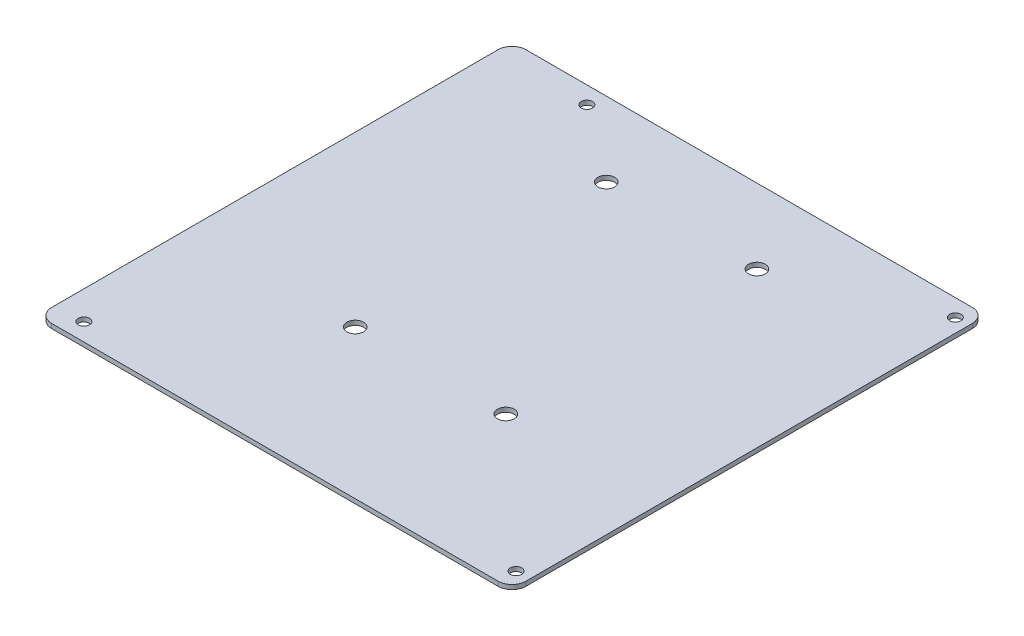
ISO-10303-21;
HEADER;
FILE_DESCRIPTION(('STEP AP214'),'2;1');
FILE_NAME('part.step','',(''),(''),'','','');
FILE_SCHEMA(('AUTOMOTIVE_DESIGN { 1 0 10303 214 1 1 1 1 }'));
ENDSEC;
DATA;
#1=APPLICATION_CONTEXT('core data for automotive mechanical design processes');
#2=APPLICATION_PROTOCOL_DEFINITION('international standard','automotive_design',2000,#1);
#3=PRODUCT_CONTEXT('',#1,'mechanical');
#4=PRODUCT('Part','Part','',(#3));
#5=PRODUCT_RELATED_PRODUCT_CATEGORY('part','',(#4));
#6=PRODUCT_DEFINITION_FORMATION('','',#4);
#7=PRODUCT_DEFINITION_CONTEXT('part definition',#1,'design');
#8=PRODUCT_DEFINITION('design','',#6,#7);
#9=PRODUCT_DEFINITION_SHAPE('','',#8);
#10=(LENGTH_UNIT() NAMED_UNIT(*) SI_UNIT(.MILLI.,.METRE.));
#11=(NAMED_UNIT(*) PLANE_ANGLE_UNIT() SI_UNIT($,.RADIAN.));
#12=(NAMED_UNIT(*) SI_UNIT($,.STERADIAN.) SOLID_ANGLE_UNIT());
#13=UNCERTAINTY_MEASURE_WITH_UNIT(LENGTH_MEASURE(1.E-05),#10,'distance_accuracy_value','');
#14=(GEOMETRIC_REPRESENTATION_CONTEXT(3) GLOBAL_UNCERTAINTY_ASSIGNED_CONTEXT((#13)) GLOBAL_UNIT_ASSIGNED_CONTEXT((#10,
#11,#12)) REPRESENTATION_CONTEXT('',''));
#15=CARTESIAN_POINT('',(0.,0.,0.));
#16=DIRECTION('',(0.,0.,1.));
#17=DIRECTION('',(1.,0.,0.));
#18=AXIS2_PLACEMENT_3D('',#15,#16,#17);
#19=CARTESIAN_POINT('',(85.,1.6,85.));
#20=DIRECTION('',(-1.,0.,0.));
#21=DIRECTION('',(0.,0.,1.));
#22=AXIS2_PLACEMENT_3D('',#19,#20,#21);
#23=PLANE('',#22);
#24=DIRECTION('',(0.,0.,-1.));
#25=VECTOR('',#24,1.);
#26=CARTESIAN_POINT('',(85.,0.,85.));
#27=LINE('',#26,#25);
#28=CARTESIAN_POINT('',(85.,0.,80.));
#29=VERTEX_POINT('',#28);
#30=CARTESIAN_POINT('',(85.,0.,-80.));
#31=VERTEX_POINT('',#30);
#32=EDGE_CURVE('E142',#29,#31,#27,.T.);
#33=ORIENTED_EDGE('',*,*,#32,.T.);
#34=DIRECTION('',(0.,-1.,0.));
#35=VECTOR('',#34,1.);
#36=CARTESIAN_POINT('',(85.,1.6,-80.));
#37=LINE('',#36,#35);
#38=CARTESIAN_POINT('',(85.,1.6,-80.));
#39=VERTEX_POINT('',#38);
#40=EDGE_CURVE('E117',#31,#39,#37,.F.);
#41=ORIENTED_EDGE('',*,*,#40,.T.);
#42=DIRECTION('',(0.,0.,-1.));
#43=VECTOR('',#42,1.);
#44=CARTESIAN_POINT('',(85.,1.6,85.));
#45=LINE('',#44,#43);
#46=CARTESIAN_POINT('',(85.,1.6,80.));
#47=VERTEX_POINT('',#46);
#48=EDGE_CURVE('E156',#47,#39,#45,.T.);
#49=ORIENTED_EDGE('',*,*,#48,.F.);
#50=DIRECTION('',(0.,-1.,0.));
#51=VECTOR('',#50,1.);
#52=CARTESIAN_POINT('',(85.,1.6,80.));
#53=LINE('',#52,#51);
#54=EDGE_CURVE('E123',#47,#29,#53,.T.);
#55=ORIENTED_EDGE('',*,*,#54,.T.);
#56=EDGE_LOOP('',(#33,#41,#49,#55));
#57=FACE_BOUND('',#56,.T.);
#58=ADVANCED_FACE('F43',(#57),#23,.F.);
#59=CARTESIAN_POINT('',(-85.,1.6,-85.));
#60=DIRECTION('',(0.,0.,1.));
#61=DIRECTION('',(1.,0.,0.));
#62=AXIS2_PLACEMENT_3D('',#59,#60,#61);
#63=PLANE('',#62);
#64=DIRECTION('',(-1.,0.,0.));
#65=VECTOR('',#64,1.);
#66=CARTESIAN_POINT('',(-85.,1.6,-85.));
#67=LINE('',#66,#65);
#68=CARTESIAN_POINT('',(80.,1.6,-85.));
#69=VERTEX_POINT('',#68);
#70=CARTESIAN_POINT('',(-80.,1.6,-85.));
#71=VERTEX_POINT('',#70);
#72=EDGE_CURVE('E133',#69,#71,#67,.T.);
#73=ORIENTED_EDGE('',*,*,#72,.F.);
#74=DIRECTION('',(0.,-1.,0.));
#75=VECTOR('',#74,1.);
#76=CARTESIAN_POINT('',(80.,1.6,-85.));
#77=LINE('',#76,#75);
#78=CARTESIAN_POINT('',(80.,0.,-85.));
#79=VERTEX_POINT('',#78);
#80=EDGE_CURVE('E116',#69,#79,#77,.T.);
#81=ORIENTED_EDGE('',*,*,#80,.T.);
#82=DIRECTION('',(-1.,0.,0.));
#83=VECTOR('',#82,1.);
#84=CARTESIAN_POINT('',(-85.,0.,-85.));
#85=LINE('',#84,#83);
#86=CARTESIAN_POINT('',(-80.,0.,-85.));
#87=VERTEX_POINT('',#86);
#88=EDGE_CURVE('E130',#79,#87,#85,.T.);
#89=ORIENTED_EDGE('',*,*,#88,.T.);
#90=DIRECTION('',(0.,-1.,0.));
#91=VECTOR('',#90,1.);
#92=CARTESIAN_POINT('',(-80.,1.6,-85.));
#93=LINE('',#92,#91);
#94=EDGE_CURVE('E136',#87,#71,#93,.F.);
#95=ORIENTED_EDGE('',*,*,#94,.T.);
#96=EDGE_LOOP('',(#73,#81,#89,#95));
#97=FACE_BOUND('',#96,.T.);
#98=ADVANCED_FACE('F129',(#97),#63,.F.);
#99=CARTESIAN_POINT('',(-85.,1.6,85.));
#100=DIRECTION('',(1.,0.,0.));
#101=DIRECTION('',(0.,0.,-1.));
#102=AXIS2_PLACEMENT_3D('',#99,#100,#101);
#103=PLANE('',#102);
#104=DIRECTION('',(0.,0.,1.));
#105=VECTOR('',#104,1.);
#106=CARTESIAN_POINT('',(-85.,1.6,85.));
#107=LINE('',#106,#105);
#108=CARTESIAN_POINT('',(-85.,1.6,-80.));
#109=VERTEX_POINT('',#108);
#110=CARTESIAN_POINT('',(-85.,1.6,80.));
#111=VERTEX_POINT('',#110);
#112=EDGE_CURVE('E229',#109,#111,#107,.T.);
#113=ORIENTED_EDGE('',*,*,#112,.F.);
#114=DIRECTION('',(0.,-1.,0.));
#115=VECTOR('',#114,1.);
#116=CARTESIAN_POINT('',(-85.,1.6,-80.));
#117=LINE('',#116,#115);
#118=CARTESIAN_POINT('',(-85.,0.,-80.));
#119=VERTEX_POINT('',#118);
#120=EDGE_CURVE('E186',#109,#119,#117,.T.);
#121=ORIENTED_EDGE('',*,*,#120,.T.);
#122=DIRECTION('',(0.,0.,1.));
#123=VECTOR('',#122,1.);
#124=CARTESIAN_POINT('',(-85.,0.,85.));
#125=LINE('',#124,#123);
#126=CARTESIAN_POINT('',(-85.,0.,80.));
#127=VERTEX_POINT('',#126);
#128=EDGE_CURVE('E141',#119,#127,#125,.T.);
#129=ORIENTED_EDGE('',*,*,#128,.T.);
#130=DIRECTION('',(0.,-1.,0.));
#131=VECTOR('',#130,1.);
#132=CARTESIAN_POINT('',(-85.,1.6,80.));
#133=LINE('',#132,#131);
#134=EDGE_CURVE('E183',#127,#111,#133,.F.);
#135=ORIENTED_EDGE('',*,*,#134,.T.);
#136=EDGE_LOOP('',(#113,#121,#129,#135));
#137=FACE_BOUND('',#136,.T.);
#138=ADVANCED_FACE('F247',(#137),#103,.F.);
#139=CARTESIAN_POINT('',(-85.,1.6,85.));
#140=DIRECTION('',(0.,0.,-1.));
#141=DIRECTION('',(-1.,0.,0.));
#142=AXIS2_PLACEMENT_3D('',#139,#140,#141);
#143=PLANE('',#142);
#144=DIRECTION('',(1.,0.,0.));
#145=VECTOR('',#144,1.);
#146=CARTESIAN_POINT('',(-85.,1.6,85.));
#147=LINE('',#146,#145);
#148=CARTESIAN_POINT('',(-80.,1.6,85.));
#149=VERTEX_POINT('',#148);
#150=CARTESIAN_POINT('',(80.,1.6,85.));
#151=VERTEX_POINT('',#150);
#152=EDGE_CURVE('E158',#149,#151,#147,.T.);
#153=ORIENTED_EDGE('',*,*,#152,.F.);
#154=DIRECTION('',(0.,-1.,0.));
#155=VECTOR('',#154,1.);
#156=CARTESIAN_POINT('',(-80.,1.6,85.));
#157=LINE('',#156,#155);
#158=CARTESIAN_POINT('',(-80.,0.,85.));
#159=VERTEX_POINT('',#158);
#160=EDGE_CURVE('E11',#149,#159,#157,.T.);
#161=ORIENTED_EDGE('',*,*,#160,.T.);
#162=DIRECTION('',(1.,0.,0.));
#163=VECTOR('',#162,1.);
#164=CARTESIAN_POINT('',(-85.,0.,85.));
#165=LINE('',#164,#163);
#166=CARTESIAN_POINT('',(80.,0.,85.));
#167=VERTEX_POINT('',#166);
#168=EDGE_CURVE('E147',#159,#167,#165,.T.);
#169=ORIENTED_EDGE('',*,*,#168,.T.);
#170=DIRECTION('',(0.,-1.,0.));
#171=VECTOR('',#170,1.);
#172=CARTESIAN_POINT('',(80.,1.6,85.));
#173=LINE('',#172,#171);
#174=EDGE_CURVE('E53',#167,#151,#173,.F.);
#175=ORIENTED_EDGE('',*,*,#174,.T.);
#176=EDGE_LOOP('',(#153,#161,#169,#175));
#177=FACE_BOUND('',#176,.T.);
#178=ADVANCED_FACE('F241',(#177),#143,.F.);
#179=CARTESIAN_POINT('',(0.,1.6,0.));
#180=DIRECTION('',(0.,-1.,0.));
#181=DIRECTION('',(0.,0.,-1.));
#182=AXIS2_PLACEMENT_3D('',#179,#180,#181);
#183=PLANE('',#182);
#184=CARTESIAN_POINT('',(29.5,1.6,-58.3));
#185=DIRECTION('',(0.,1.,0.));
#186=DIRECTION('',(0.,0.,1.));
#187=AXIS2_PLACEMENT_3D('',#184,#185,#186);
#188=CIRCLE('',#187,3.);
#189=CARTESIAN_POINT('',(29.5,1.6,-55.3));
#190=VERTEX_POINT('',#189);
#191=EDGE_CURVE('E318',#190,#190,#188,.T.);
#192=ORIENTED_EDGE('',*,*,#191,.F.);
#193=EDGE_LOOP('',(#192));
#194=FACE_BOUND('',#193,.T.);
#195=CARTESIAN_POINT('',(-24.5,1.6,31.7));
#196=DIRECTION('',(0.,1.,0.));
#197=DIRECTION('',(0.,0.,1.));
#198=AXIS2_PLACEMENT_3D('',#195,#196,#197);
#199=CIRCLE('',#198,2.99999999999999);
#200=CARTESIAN_POINT('',(-24.5,1.6,34.7));
#201=VERTEX_POINT('',#200);
#202=EDGE_CURVE('E313',#201,#201,#199,.T.);
#203=ORIENTED_EDGE('',*,*,#202,.F.);
#204=EDGE_LOOP('',(#203));
#205=FACE_BOUND('',#204,.T.);
#206=CARTESIAN_POINT('',(29.5,1.6,31.7));
#207=DIRECTION('',(0.,1.,0.));
#208=DIRECTION('',(0.,0.,1.));
#209=AXIS2_PLACEMENT_3D('',#206,#207,#208);
#210=CIRCLE('',#209,3.);
#211=CARTESIAN_POINT('',(29.5,1.6,34.7));
#212=VERTEX_POINT('',#211);
#213=EDGE_CURVE('E311',#212,#212,#210,.T.);
#214=ORIENTED_EDGE('',*,*,#213,.F.);
#215=EDGE_LOOP('',(#214));
#216=FACE_BOUND('',#215,.T.);
#217=CARTESIAN_POINT('',(-24.5,1.6,-58.3));
#218=DIRECTION('',(0.,1.,0.));
#219=DIRECTION('',(0.,0.,1.));
#220=AXIS2_PLACEMENT_3D('',#217,#218,#219);
#221=CIRCLE('',#220,3.);
#222=CARTESIAN_POINT('',(-24.5,1.6,-55.3));
#223=VERTEX_POINT('',#222);
#224=EDGE_CURVE('E197',#223,#223,#221,.T.);
#225=ORIENTED_EDGE('',*,*,#224,.F.);
#226=EDGE_LOOP('',(#225));
#227=FACE_BOUND('',#226,.T.);
#228=CARTESIAN_POINT('',(-74.84,1.6,78.65));
#229=DIRECTION('',(0.,1.,0.));
#230=DIRECTION('',(0.,0.,1.));
#231=AXIS2_PLACEMENT_3D('',#228,#229,#230);
#232=CIRCLE('',#231,2.03200000000001);
#233=CARTESIAN_POINT('',(-74.84,1.6,80.682));
#234=VERTEX_POINT('',#233);
#235=EDGE_CURVE('E328',#234,#234,#232,.T.);
#236=ORIENTED_EDGE('',*,*,#235,.F.);
#237=EDGE_LOOP('',(#236));
#238=FACE_BOUND('',#237,.T.);
#239=CARTESIAN_POINT('',(80.1,1.6,78.65));
#240=DIRECTION('',(0.,1.,0.));
#241=DIRECTION('',(0.,0.,1.));
#242=AXIS2_PLACEMENT_3D('',#239,#240,#241);
#243=CIRCLE('',#242,2.03200000000001);
#244=CARTESIAN_POINT('',(80.1,1.6,80.682));
#245=VERTEX_POINT('',#244);
#246=EDGE_CURVE('E336',#245,#245,#243,.T.);
#247=ORIENTED_EDGE('',*,*,#246,.F.);
#248=EDGE_LOOP('',(#247));
#249=FACE_BOUND('',#248,.T.);
#250=CARTESIAN_POINT('',(80.1,1.6,-78.83));
#251=DIRECTION('',(0.,1.,0.));
#252=DIRECTION('',(0.,0.,1.));
#253=AXIS2_PLACEMENT_3D('',#250,#251,#252);
#254=CIRCLE('',#253,2.03200000000001);
#255=CARTESIAN_POINT('',(80.1,1.6,-76.798));
#256=VERTEX_POINT('',#255);
#257=EDGE_CURVE('E221',#256,#256,#254,.T.);
#258=ORIENTED_EDGE('',*,*,#257,.F.);
#259=EDGE_LOOP('',(#258));
#260=FACE_BOUND('',#259,.T.);
#261=CARTESIAN_POINT('',(-51.98,1.6,-78.83));
#262=DIRECTION('',(0.,1.,0.));
#263=DIRECTION('',(0.,0.,1.));
#264=AXIS2_PLACEMENT_3D('',#261,#262,#263);
#265=CIRCLE('',#264,2.032);
#266=CARTESIAN_POINT('',(-51.98,1.6,-76.798));
#267=VERTEX_POINT('',#266);
#268=EDGE_CURVE('E209',#267,#267,#265,.T.);
#269=ORIENTED_EDGE('',*,*,#268,.F.);
#270=EDGE_LOOP('',(#269));
#271=FACE_BOUND('',#270,.T.);
#272=ORIENTED_EDGE('',*,*,#48,.T.);
#273=CARTESIAN_POINT('',(80.,1.6,-80.));
#274=DIRECTION('',(0.,-1.,0.));
#275=DIRECTION('',(0.,0.,-1.));
#276=AXIS2_PLACEMENT_3D('',#273,#274,#275);
#277=CIRCLE('',#276,5.);
#278=EDGE_CURVE('E180',#39,#69,#277,.F.);
#279=ORIENTED_EDGE('',*,*,#278,.T.);
#280=ORIENTED_EDGE('',*,*,#72,.T.);
#281=CARTESIAN_POINT('',(-80.,1.6,-80.));
#282=DIRECTION('',(0.,-1.,0.));
#283=DIRECTION('',(0.,0.,-1.));
#284=AXIS2_PLACEMENT_3D('',#281,#282,#283);
#285=CIRCLE('',#284,5.);
#286=EDGE_CURVE('E177',#71,#109,#285,.F.);
#287=ORIENTED_EDGE('',*,*,#286,.T.);
#288=ORIENTED_EDGE('',*,*,#112,.T.);
#289=CARTESIAN_POINT('',(-80.,1.6,80.));
#290=DIRECTION('',(0.,-1.,0.));
#291=DIRECTION('',(0.,0.,-1.));
#292=AXIS2_PLACEMENT_3D('',#289,#290,#291);
#293=CIRCLE('',#292,5.);
#294=EDGE_CURVE('E67',#111,#149,#293,.F.);
#295=ORIENTED_EDGE('',*,*,#294,.T.);
#296=ORIENTED_EDGE('',*,*,#152,.T.);
#297=CARTESIAN_POINT('',(80.,1.6,80.));
#298=DIRECTION('',(0.,-1.,0.));
#299=DIRECTION('',(0.,0.,-1.));
#300=AXIS2_PLACEMENT_3D('',#297,#298,#299);
#301=CIRCLE('',#300,5.);
#302=EDGE_CURVE('E172',#151,#47,#301,.F.);
#303=ORIENTED_EDGE('',*,*,#302,.T.);
#304=EDGE_LOOP('',(#272,#279,#280,#287,#288,#295,#296,#303));
#305=FACE_BOUND('',#304,.T.);
#306=ADVANCED_FACE('F234',(#194,#205,#216,#227,#238,#249,#260,#271,#305),#183,.F.);
#307=CARTESIAN_POINT('',(0.,0.,0.));
#308=DIRECTION('',(0.,-1.,0.));
#309=DIRECTION('',(0.,0.,-1.));
#310=AXIS2_PLACEMENT_3D('',#307,#308,#309);
#311=PLANE('',#310);
#312=CARTESIAN_POINT('',(29.5,0.,-58.3));
#313=DIRECTION('',(0.,-1.,0.));
#314=DIRECTION('',(0.,0.,-1.));
#315=AXIS2_PLACEMENT_3D('',#312,#313,#314);
#316=CIRCLE('',#315,3.);
#317=CARTESIAN_POINT('',(29.5,0.,-61.3));
#318=VERTEX_POINT('',#317);
#319=EDGE_CURVE('E47',#318,#318,#316,.T.);
#320=ORIENTED_EDGE('',*,*,#319,.F.);
#321=EDGE_LOOP('',(#320));
#322=FACE_BOUND('',#321,.T.);
#323=CARTESIAN_POINT('',(-24.5,0.,31.7));
#324=DIRECTION('',(0.,-1.,0.));
#325=DIRECTION('',(0.,0.,-1.));
#326=AXIS2_PLACEMENT_3D('',#323,#324,#325);
#327=CIRCLE('',#326,2.99999999999999);
#328=CARTESIAN_POINT('',(-24.5,0.,28.7));
#329=VERTEX_POINT('',#328);
#330=EDGE_CURVE('E199',#329,#329,#327,.T.);
#331=ORIENTED_EDGE('',*,*,#330,.F.);
#332=EDGE_LOOP('',(#331));
#333=FACE_BOUND('',#332,.T.);
#334=CARTESIAN_POINT('',(29.5,0.,31.7));
#335=DIRECTION('',(0.,-1.,0.));
#336=DIRECTION('',(0.,0.,-1.));
#337=AXIS2_PLACEMENT_3D('',#334,#335,#336);
#338=CIRCLE('',#337,3.);
#339=CARTESIAN_POINT('',(29.5,0.,28.7));
#340=VERTEX_POINT('',#339);
#341=EDGE_CURVE('E196',#340,#340,#338,.T.);
#342=ORIENTED_EDGE('',*,*,#341,.F.);
#343=EDGE_LOOP('',(#342));
#344=FACE_BOUND('',#343,.T.);
#345=CARTESIAN_POINT('',(-24.5,0.,-58.3));
#346=DIRECTION('',(0.,-1.,0.));
#347=DIRECTION('',(0.,0.,-1.));
#348=AXIS2_PLACEMENT_3D('',#345,#346,#347);
#349=CIRCLE('',#348,3.);
#350=CARTESIAN_POINT('',(-24.5,0.,-61.3));
#351=VERTEX_POINT('',#350);
#352=EDGE_CURVE('E192',#351,#351,#349,.T.);
#353=ORIENTED_EDGE('',*,*,#352,.F.);
#354=EDGE_LOOP('',(#353));
#355=FACE_BOUND('',#354,.T.);
#356=CARTESIAN_POINT('',(-74.84,0.,78.65));
#357=DIRECTION('',(0.,1.,0.));
#358=DIRECTION('',(0.,0.,1.));
#359=AXIS2_PLACEMENT_3D('',#356,#357,#358);
#360=CIRCLE('',#359,2.03200000000001);
#361=CARTESIAN_POINT('',(-74.84,0.,80.682));
#362=VERTEX_POINT('',#361);
#363=EDGE_CURVE('E150',#362,#362,#360,.T.);
#364=ORIENTED_EDGE('',*,*,#363,.T.);
#365=EDGE_LOOP('',(#364));
#366=FACE_BOUND('',#365,.T.);
#367=CARTESIAN_POINT('',(80.1,0.,78.65));
#368=DIRECTION('',(0.,1.,0.));
#369=DIRECTION('',(0.,0.,1.));
#370=AXIS2_PLACEMENT_3D('',#367,#368,#369);
#371=CIRCLE('',#370,2.03200000000001);
#372=CARTESIAN_POINT('',(80.1,0.,80.682));
#373=VERTEX_POINT('',#372);
#374=EDGE_CURVE('E332',#373,#373,#371,.T.);
#375=ORIENTED_EDGE('',*,*,#374,.T.);
#376=EDGE_LOOP('',(#375));
#377=FACE_BOUND('',#376,.T.);
#378=CARTESIAN_POINT('',(80.1,0.,-78.83));
#379=DIRECTION('',(0.,1.,0.));
#380=DIRECTION('',(0.,0.,1.));
#381=AXIS2_PLACEMENT_3D('',#378,#379,#380);
#382=CIRCLE('',#381,2.03200000000001);
#383=CARTESIAN_POINT('',(80.1,0.,-76.798));
#384=VERTEX_POINT('',#383);
#385=EDGE_CURVE('E340',#384,#384,#382,.T.);
#386=ORIENTED_EDGE('',*,*,#385,.T.);
#387=EDGE_LOOP('',(#386));
#388=FACE_BOUND('',#387,.T.);
#389=CARTESIAN_POINT('',(-51.98,0.,-78.83));
#390=DIRECTION('',(0.,1.,0.));
#391=DIRECTION('',(0.,0.,1.));
#392=AXIS2_PLACEMENT_3D('',#389,#390,#391);
#393=CIRCLE('',#392,2.032);
#394=CARTESIAN_POINT('',(-51.98,0.,-76.798));
#395=VERTEX_POINT('',#394);
#396=EDGE_CURVE('E215',#395,#395,#393,.T.);
#397=ORIENTED_EDGE('',*,*,#396,.T.);
#398=EDGE_LOOP('',(#397));
#399=FACE_BOUND('',#398,.T.);
#400=ORIENTED_EDGE('',*,*,#88,.F.);
#401=CARTESIAN_POINT('',(80.,0.,-80.));
#402=DIRECTION('',(0.,-1.,0.));
#403=DIRECTION('',(0.,0.,-1.));
#404=AXIS2_PLACEMENT_3D('',#401,#402,#403);
#405=CIRCLE('',#404,5.);
#406=EDGE_CURVE('E112',#79,#31,#405,.T.);
#407=ORIENTED_EDGE('',*,*,#406,.T.);
#408=ORIENTED_EDGE('',*,*,#32,.F.);
#409=CARTESIAN_POINT('',(80.,0.,80.));
#410=DIRECTION('',(0.,-1.,0.));
#411=DIRECTION('',(0.,0.,-1.));
#412=AXIS2_PLACEMENT_3D('',#409,#410,#411);
#413=CIRCLE('',#412,5.);
#414=EDGE_CURVE('E135',#29,#167,#413,.T.);
#415=ORIENTED_EDGE('',*,*,#414,.T.);
#416=ORIENTED_EDGE('',*,*,#168,.F.);
#417=CARTESIAN_POINT('',(-80.,0.,80.));
#418=DIRECTION('',(0.,-1.,0.));
#419=DIRECTION('',(0.,0.,-1.));
#420=AXIS2_PLACEMENT_3D('',#417,#418,#419);
#421=CIRCLE('',#420,5.);
#422=EDGE_CURVE('E162',#159,#127,#421,.T.);
#423=ORIENTED_EDGE('',*,*,#422,.T.);
#424=ORIENTED_EDGE('',*,*,#128,.F.);
#425=CARTESIAN_POINT('',(-80.,0.,-80.));
#426=DIRECTION('',(0.,-1.,0.));
#427=DIRECTION('',(0.,0.,-1.));
#428=AXIS2_PLACEMENT_3D('',#425,#426,#427);
#429=CIRCLE('',#428,5.);
#430=EDGE_CURVE('E124',#119,#87,#429,.T.);
#431=ORIENTED_EDGE('',*,*,#430,.T.);
#432=EDGE_LOOP('',(#400,#407,#408,#415,#416,#423,#424,#431));
#433=FACE_BOUND('',#432,.T.);
#434=ADVANCED_FACE('F138',(#322,#333,#344,#355,#366,#377,#388,#399,#433),#311,.T.);
#435=CARTESIAN_POINT('',(80.,1.6,-80.));
#436=DIRECTION('',(0.,-1.,0.));
#437=DIRECTION('',(0.,0.,-1.));
#438=AXIS2_PLACEMENT_3D('',#435,#436,#437);
#439=CYLINDRICAL_SURFACE('',#438,5.);
#440=ORIENTED_EDGE('',*,*,#278,.F.);
#441=ORIENTED_EDGE('',*,*,#40,.F.);
#442=ORIENTED_EDGE('',*,*,#406,.F.);
#443=ORIENTED_EDGE('',*,*,#80,.F.);
#444=EDGE_LOOP('',(#440,#441,#442,#443));
#445=FACE_BOUND('',#444,.T.);
#446=ADVANCED_FACE('F115',(#445),#439,.T.);
#447=CARTESIAN_POINT('',(-80.,1.6,-80.));
#448=DIRECTION('',(0.,-1.,0.));
#449=DIRECTION('',(0.,0.,-1.));
#450=AXIS2_PLACEMENT_3D('',#447,#448,#449);
#451=CYLINDRICAL_SURFACE('',#450,5.);
#452=ORIENTED_EDGE('',*,*,#286,.F.);
#453=ORIENTED_EDGE('',*,*,#94,.F.);
#454=ORIENTED_EDGE('',*,*,#430,.F.);
#455=ORIENTED_EDGE('',*,*,#120,.F.);
#456=EDGE_LOOP('',(#452,#453,#454,#455));
#457=FACE_BOUND('',#456,.T.);
#458=ADVANCED_FACE('F251',(#457),#451,.T.);
#459=CARTESIAN_POINT('',(-80.,1.6,80.));
#460=DIRECTION('',(0.,-1.,0.));
#461=DIRECTION('',(0.,0.,-1.));
#462=AXIS2_PLACEMENT_3D('',#459,#460,#461);
#463=CYLINDRICAL_SURFACE('',#462,5.);
#464=ORIENTED_EDGE('',*,*,#294,.F.);
#465=ORIENTED_EDGE('',*,*,#134,.F.);
#466=ORIENTED_EDGE('',*,*,#422,.F.);
#467=ORIENTED_EDGE('',*,*,#160,.F.);
#468=EDGE_LOOP('',(#464,#465,#466,#467));
#469=FACE_BOUND('',#468,.T.);
#470=ADVANCED_FACE('F243',(#469),#463,.T.);
#471=CARTESIAN_POINT('',(80.,1.6,80.));
#472=DIRECTION('',(0.,-1.,0.));
#473=DIRECTION('',(0.,0.,-1.));
#474=AXIS2_PLACEMENT_3D('',#471,#472,#473);
#475=CYLINDRICAL_SURFACE('',#474,5.);
#476=ORIENTED_EDGE('',*,*,#302,.F.);
#477=ORIENTED_EDGE('',*,*,#174,.F.);
#478=ORIENTED_EDGE('',*,*,#414,.F.);
#479=ORIENTED_EDGE('',*,*,#54,.F.);
#480=EDGE_LOOP('',(#476,#477,#478,#479));
#481=FACE_BOUND('',#480,.T.);
#482=ADVANCED_FACE('F45',(#481),#475,.T.);
#483=CARTESIAN_POINT('',(-51.98,0.,-78.83));
#484=DIRECTION('',(0.,1.,0.));
#485=DIRECTION('',(0.,0.,1.));
#486=AXIS2_PLACEMENT_3D('',#483,#484,#485);
#487=CYLINDRICAL_SURFACE('',#486,2.032);
#488=ORIENTED_EDGE('',*,*,#396,.F.);
#489=EDGE_LOOP('',(#488));
#490=FACE_BOUND('',#489,.T.);
#491=ORIENTED_EDGE('',*,*,#268,.T.);
#492=EDGE_LOOP('',(#491));
#493=FACE_BOUND('',#492,.T.);
#494=ADVANCED_FACE('F276',(#490,#493),#487,.F.);
#495=CARTESIAN_POINT('',(80.1,0.,-78.83));
#496=DIRECTION('',(0.,1.,0.));
#497=DIRECTION('',(0.,0.,1.));
#498=AXIS2_PLACEMENT_3D('',#495,#496,#497);
#499=CYLINDRICAL_SURFACE('',#498,2.03200000000001);
#500=ORIENTED_EDGE('',*,*,#385,.F.);
#501=EDGE_LOOP('',(#500));
#502=FACE_BOUND('',#501,.T.);
#503=ORIENTED_EDGE('',*,*,#257,.T.);
#504=EDGE_LOOP('',(#503));
#505=FACE_BOUND('',#504,.T.);
#506=ADVANCED_FACE('F279',(#502,#505),#499,.F.);
#507=CARTESIAN_POINT('',(80.1,0.,78.65));
#508=DIRECTION('',(0.,1.,0.));
#509=DIRECTION('',(0.,0.,1.));
#510=AXIS2_PLACEMENT_3D('',#507,#508,#509);
#511=CYLINDRICAL_SURFACE('',#510,2.03200000000001);
#512=ORIENTED_EDGE('',*,*,#374,.F.);
#513=EDGE_LOOP('',(#512));
#514=FACE_BOUND('',#513,.T.);
#515=ORIENTED_EDGE('',*,*,#246,.T.);
#516=EDGE_LOOP('',(#515));
#517=FACE_BOUND('',#516,.T.);
#518=ADVANCED_FACE('F283',(#514,#517),#511,.F.);
#519=CARTESIAN_POINT('',(-74.84,0.,78.65));
#520=DIRECTION('',(0.,1.,0.));
#521=DIRECTION('',(0.,0.,1.));
#522=AXIS2_PLACEMENT_3D('',#519,#520,#521);
#523=CYLINDRICAL_SURFACE('',#522,2.03200000000001);
#524=ORIENTED_EDGE('',*,*,#363,.F.);
#525=EDGE_LOOP('',(#524));
#526=FACE_BOUND('',#525,.T.);
#527=ORIENTED_EDGE('',*,*,#235,.T.);
#528=EDGE_LOOP('',(#527));
#529=FACE_BOUND('',#528,.T.);
#530=ADVANCED_FACE('F287',(#526,#529),#523,.F.);
#531=CARTESIAN_POINT('',(-24.5,-8.4,-58.3));
#532=DIRECTION('',(0.,1.,0.));
#533=DIRECTION('',(0.,0.,1.));
#534=AXIS2_PLACEMENT_3D('',#531,#532,#533);
#535=CYLINDRICAL_SURFACE('',#534,3.);
#536=ORIENTED_EDGE('',*,*,#352,.T.);
#537=EDGE_LOOP('',(#536));
#538=FACE_BOUND('',#537,.T.);
#539=ORIENTED_EDGE('',*,*,#224,.T.);
#540=EDGE_LOOP('',(#539));
#541=FACE_BOUND('',#540,.T.);
#542=ADVANCED_FACE('F291',(#538,#541),#535,.F.);
#543=CARTESIAN_POINT('',(29.5,-8.4,31.7));
#544=DIRECTION('',(0.,1.,0.));
#545=DIRECTION('',(0.,0.,1.));
#546=AXIS2_PLACEMENT_3D('',#543,#544,#545);
#547=CYLINDRICAL_SURFACE('',#546,3.);
#548=ORIENTED_EDGE('',*,*,#341,.T.);
#549=EDGE_LOOP('',(#548));
#550=FACE_BOUND('',#549,.T.);
#551=ORIENTED_EDGE('',*,*,#213,.T.);
#552=EDGE_LOOP('',(#551));
#553=FACE_BOUND('',#552,.T.);
#554=ADVANCED_FACE('F295',(#550,#553),#547,.F.);
#555=CARTESIAN_POINT('',(-24.5,-8.4,31.7));
#556=DIRECTION('',(0.,1.,0.));
#557=DIRECTION('',(0.,0.,1.));
#558=AXIS2_PLACEMENT_3D('',#555,#556,#557);
#559=CYLINDRICAL_SURFACE('',#558,2.99999999999999);
#560=ORIENTED_EDGE('',*,*,#330,.T.);
#561=EDGE_LOOP('',(#560));
#562=FACE_BOUND('',#561,.T.);
#563=ORIENTED_EDGE('',*,*,#202,.T.);
#564=EDGE_LOOP('',(#563));
#565=FACE_BOUND('',#564,.T.);
#566=ADVANCED_FACE('F297',(#562,#565),#559,.F.);
#567=CARTESIAN_POINT('',(29.5,-8.4,-58.3));
#568=DIRECTION('',(0.,1.,0.));
#569=DIRECTION('',(0.,0.,1.));
#570=AXIS2_PLACEMENT_3D('',#567,#568,#569);
#571=CYLINDRICAL_SURFACE('',#570,3.);
#572=ORIENTED_EDGE('',*,*,#319,.T.);
#573=EDGE_LOOP('',(#572));
#574=FACE_BOUND('',#573,.T.);
#575=ORIENTED_EDGE('',*,*,#191,.T.);
#576=EDGE_LOOP('',(#575));
#577=FACE_BOUND('',#576,.T.);
#578=ADVANCED_FACE('F300',(#574,#577),#571,.F.);
#579=CLOSED_SHELL('',(#58,#98,#138,#178,#306,#434,#446,#458,#470,#482,#494,#506,#518,#530,#542,
#554,#566,#578));
#580=MANIFOLD_SOLID_BREP('B2',#579);
#581=ADVANCED_BREP_SHAPE_REPRESENTATION('',(#18,#580),#14);
#582=SHAPE_DEFINITION_REPRESENTATION(#9,#581);
ENDSEC;
END-ISO-10303-21;
